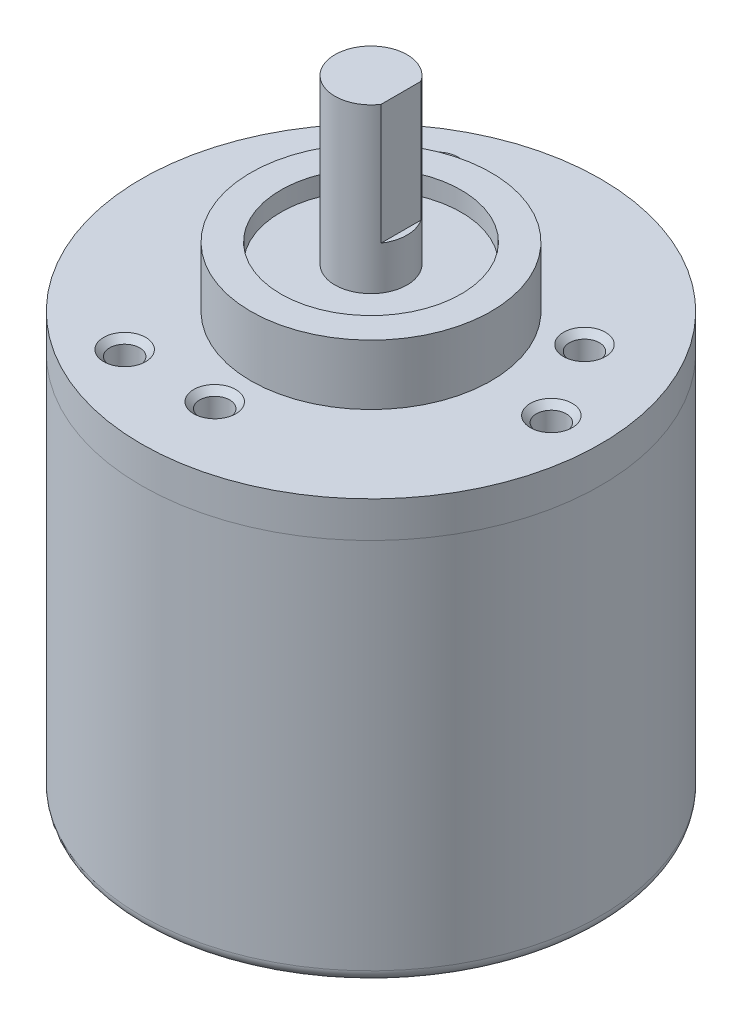
ISO-10303-21;
HEADER;
FILE_DESCRIPTION(('STEP AP214'),'2;1');
FILE_NAME('part.step','',(''),(''),'','','');
FILE_SCHEMA(('AUTOMOTIVE_DESIGN { 1 0 10303 214 1 1 1 1 }'));
ENDSEC;
DATA;
#1=APPLICATION_CONTEXT('core data for automotive mechanical design processes');
#2=APPLICATION_PROTOCOL_DEFINITION('international standard','automotive_design',2000,#1);
#3=PRODUCT_CONTEXT('',#1,'mechanical');
#4=PRODUCT('Part','Part','',(#3));
#5=PRODUCT_RELATED_PRODUCT_CATEGORY('part','',(#4));
#6=PRODUCT_DEFINITION_FORMATION('','',#4);
#7=PRODUCT_DEFINITION_CONTEXT('part definition',#1,'design');
#8=PRODUCT_DEFINITION('design','',#6,#7);
#9=PRODUCT_DEFINITION_SHAPE('','',#8);
#10=(LENGTH_UNIT() NAMED_UNIT(*) SI_UNIT(.MILLI.,.METRE.));
#11=(NAMED_UNIT(*) PLANE_ANGLE_UNIT() SI_UNIT($,.RADIAN.));
#12=(NAMED_UNIT(*) SI_UNIT($,.STERADIAN.) SOLID_ANGLE_UNIT());
#13=UNCERTAINTY_MEASURE_WITH_UNIT(LENGTH_MEASURE(1.E-05),#10,'distance_accuracy_value','');
#14=(GEOMETRIC_REPRESENTATION_CONTEXT(3) GLOBAL_UNCERTAINTY_ASSIGNED_CONTEXT((#13)) GLOBAL_UNIT_ASSIGNED_CONTEXT((#10,
#11,#12)) REPRESENTATION_CONTEXT('',''));
#15=CARTESIAN_POINT('',(0.,0.,0.));
#16=DIRECTION('',(0.,0.,1.));
#17=DIRECTION('',(1.,0.,0.));
#18=AXIS2_PLACEMENT_3D('',#15,#16,#17);
#19=CARTESIAN_POINT('',(0.,38.4,0.));
#20=DIRECTION('',(0.,1.,0.));
#21=DIRECTION('',(0.,0.,1.));
#22=AXIS2_PLACEMENT_3D('',#19,#20,#21);
#23=PLANE('',#22);
#24=CARTESIAN_POINT('',(0.,38.4,0.));
#25=DIRECTION('',(0.,1.,0.));
#26=DIRECTION('',(0.,0.,1.));
#27=AXIS2_PLACEMENT_3D('',#24,#25,#26);
#28=CIRCLE('',#27,7.5);
#29=CARTESIAN_POINT('',(0.,38.4,7.5));
#30=VERTEX_POINT('',#29);
#31=EDGE_CURVE('E97',#30,#30,#28,.T.);
#32=ORIENTED_EDGE('',*,*,#31,.T.);
#33=EDGE_LOOP('',(#32));
#34=FACE_BOUND('',#33,.T.);
#35=CARTESIAN_POINT('',(0.,38.4,0.));
#36=DIRECTION('',(0.,1.,0.));
#37=DIRECTION('',(0.,0.,1.));
#38=AXIS2_PLACEMENT_3D('',#35,#36,#37);
#39=CIRCLE('',#38,3.);
#40=CARTESIAN_POINT('',(0.,38.4,3.));
#41=VERTEX_POINT('',#40);
#42=EDGE_CURVE('E89',#41,#41,#39,.T.);
#43=ORIENTED_EDGE('',*,*,#42,.F.);
#44=EDGE_LOOP('',(#43));
#45=FACE_BOUND('',#44,.T.);
#46=ADVANCED_FACE('F48',(#34,#45),#23,.T.);
#47=CARTESIAN_POINT('',(0.,40.,0.));
#48=DIRECTION('',(0.,-1.,0.));
#49=DIRECTION('',(0.,0.,-1.));
#50=AXIS2_PLACEMENT_3D('',#47,#48,#49);
#51=CYLINDRICAL_SURFACE('',#50,10.);
#52=CARTESIAN_POINT('',(0.,40.,0.));
#53=DIRECTION('',(0.,1.,0.));
#54=DIRECTION('',(0.,0.,1.));
#55=AXIS2_PLACEMENT_3D('',#52,#53,#54);
#56=CIRCLE('',#55,10.);
#57=CARTESIAN_POINT('',(0.,40.,10.));
#58=VERTEX_POINT('',#57);
#59=EDGE_CURVE('E13',#58,#58,#56,.T.);
#60=ORIENTED_EDGE('',*,*,#59,.F.);
#61=EDGE_LOOP('',(#60));
#62=FACE_BOUND('',#61,.T.);
#63=CARTESIAN_POINT('',(0.,35.,0.));
#64=DIRECTION('',(0.,1.,0.));
#65=DIRECTION('',(0.,0.,1.));
#66=AXIS2_PLACEMENT_3D('',#63,#64,#65);
#67=CIRCLE('',#66,10.);
#68=CARTESIAN_POINT('',(0.,35.,10.));
#69=VERTEX_POINT('',#68);
#70=EDGE_CURVE('E52',#69,#69,#67,.T.);
#71=ORIENTED_EDGE('',*,*,#70,.T.);
#72=EDGE_LOOP('',(#71));
#73=FACE_BOUND('',#72,.T.);
#74=ADVANCED_FACE('F50',(#62,#73),#51,.T.);
#75=CARTESIAN_POINT('',(0.,40.,0.));
#76=DIRECTION('',(0.,1.,0.));
#77=DIRECTION('',(0.,0.,1.));
#78=AXIS2_PLACEMENT_3D('',#75,#76,#77);
#79=PLANE('',#78);
#80=CARTESIAN_POINT('',(0.,40.,0.));
#81=DIRECTION('',(0.,1.,0.));
#82=DIRECTION('',(0.,0.,1.));
#83=AXIS2_PLACEMENT_3D('',#80,#81,#82);
#84=CIRCLE('',#83,7.5);
#85=CARTESIAN_POINT('',(0.,40.,7.5));
#86=VERTEX_POINT('',#85);
#87=EDGE_CURVE('E95',#86,#86,#84,.T.);
#88=ORIENTED_EDGE('',*,*,#87,.F.);
#89=EDGE_LOOP('',(#88));
#90=FACE_BOUND('',#89,.T.);
#91=ORIENTED_EDGE('',*,*,#59,.T.);
#92=EDGE_LOOP('',(#91));
#93=FACE_BOUND('',#92,.T.);
#94=ADVANCED_FACE('F105',(#90,#93),#79,.T.);
#95=CARTESIAN_POINT('',(0.,35.,0.));
#96=DIRECTION('',(0.,1.,0.));
#97=DIRECTION('',(0.,0.,1.));
#98=AXIS2_PLACEMENT_3D('',#95,#96,#97);
#99=PLANE('',#98);
#100=ORIENTED_EDGE('',*,*,#70,.F.);
#101=EDGE_LOOP('',(#100));
#102=FACE_BOUND('',#101,.T.);
#103=ADVANCED_FACE('F108',(#102),#99,.F.);
#104=CARTESIAN_POINT('',(0.,38.4,0.));
#105=DIRECTION('',(0.,1.,0.));
#106=DIRECTION('',(0.,0.,1.));
#107=AXIS2_PLACEMENT_3D('',#104,#105,#106);
#108=CYLINDRICAL_SURFACE('',#107,7.5);
#109=ORIENTED_EDGE('',*,*,#31,.F.);
#110=EDGE_LOOP('',(#109));
#111=FACE_BOUND('',#110,.T.);
#112=ORIENTED_EDGE('',*,*,#87,.T.);
#113=EDGE_LOOP('',(#112));
#114=FACE_BOUND('',#113,.T.);
#115=ADVANCED_FACE('F103',(#111,#114),#108,.F.);
#116=CARTESIAN_POINT('',(2.5,72.1394102980499,0.));
#117=DIRECTION('',(1.,0.,0.));
#118=DIRECTION('',(0.,0.,-1.));
#119=AXIS2_PLACEMENT_3D('',#116,#117,#118);
#120=PLANE('',#119);
#121=DIRECTION('',(0.,0.,1.));
#122=VECTOR('',#121,1.);
#123=CARTESIAN_POINT('',(2.5,42.,0.));
#124=LINE('',#123,#122);
#125=CARTESIAN_POINT('',(2.5,42.,-1.6583123951777));
#126=VERTEX_POINT('',#125);
#127=CARTESIAN_POINT('',(2.5,42.,1.6583123951777));
#128=VERTEX_POINT('',#127);
#129=EDGE_CURVE('E63',#126,#128,#124,.T.);
#130=ORIENTED_EDGE('',*,*,#129,.F.);
#131=DIRECTION('',(0.,-1.,0.));
#132=VECTOR('',#131,1.);
#133=CARTESIAN_POINT('',(2.5,72.1394102980499,-1.6583123951777));
#134=LINE('',#133,#132);
#135=CARTESIAN_POINT('',(2.5,52.,-1.6583123951777));
#136=VERTEX_POINT('',#135);
#137=EDGE_CURVE('E79',#136,#126,#134,.T.);
#138=ORIENTED_EDGE('',*,*,#137,.F.);
#139=DIRECTION('',(0.,0.,1.));
#140=VECTOR('',#139,1.);
#141=CARTESIAN_POINT('',(2.5,52.,0.));
#142=LINE('',#141,#140);
#143=CARTESIAN_POINT('',(2.5,52.,1.6583123951777));
#144=VERTEX_POINT('',#143);
#145=EDGE_CURVE('E77',#136,#144,#142,.T.);
#146=ORIENTED_EDGE('',*,*,#145,.T.);
#147=DIRECTION('',(0.,-1.,0.));
#148=VECTOR('',#147,1.);
#149=CARTESIAN_POINT('',(2.5,72.1394102980499,1.6583123951777));
#150=LINE('',#149,#148);
#151=EDGE_CURVE('E70',#144,#128,#150,.T.);
#152=ORIENTED_EDGE('',*,*,#151,.T.);
#153=EDGE_LOOP('',(#130,#138,#146,#152));
#154=FACE_BOUND('',#153,.T.);
#155=ADVANCED_FACE('F75',(#154),#120,.T.);
#156=CARTESIAN_POINT('',(0.,72.1394102980499,0.));
#157=DIRECTION('',(0.,-1.,0.));
#158=DIRECTION('',(0.,0.,-1.));
#159=AXIS2_PLACEMENT_3D('',#156,#157,#158);
#160=CYLINDRICAL_SURFACE('',#159,3.);
#161=ORIENTED_EDGE('',*,*,#42,.T.);
#162=EDGE_LOOP('',(#161));
#163=FACE_BOUND('',#162,.T.);
#164=ORIENTED_EDGE('',*,*,#137,.T.);
#165=CARTESIAN_POINT('',(0.,42.,0.));
#166=DIRECTION('',(0.,1.,0.));
#167=DIRECTION('',(0.,0.,1.));
#168=AXIS2_PLACEMENT_3D('',#165,#166,#167);
#169=CIRCLE('',#168,3.);
#170=EDGE_CURVE('E84',#128,#126,#169,.T.);
#171=ORIENTED_EDGE('',*,*,#170,.F.);
#172=ORIENTED_EDGE('',*,*,#151,.F.);
#173=CARTESIAN_POINT('',(0.,52.,0.));
#174=DIRECTION('',(0.,1.,0.));
#175=DIRECTION('',(0.,0.,1.));
#176=AXIS2_PLACEMENT_3D('',#173,#174,#175);
#177=CIRCLE('',#176,3.);
#178=EDGE_CURVE('E92',#136,#144,#177,.T.);
#179=ORIENTED_EDGE('',*,*,#178,.F.);
#180=EDGE_LOOP('',(#164,#171,#172,#179));
#181=FACE_BOUND('',#180,.T.);
#182=ADVANCED_FACE('F86',(#163,#181),#160,.T.);
#183=CARTESIAN_POINT('',(0.,52.,0.));
#184=DIRECTION('',(0.,1.,0.));
#185=DIRECTION('',(0.,0.,1.));
#186=AXIS2_PLACEMENT_3D('',#183,#184,#185);
#187=PLANE('',#186);
#188=ORIENTED_EDGE('',*,*,#145,.F.);
#189=ORIENTED_EDGE('',*,*,#178,.T.);
#190=EDGE_LOOP('',(#188,#189));
#191=FACE_BOUND('',#190,.T.);
#192=ADVANCED_FACE('F130',(#191),#187,.T.);
#193=CARTESIAN_POINT('',(0.,42.,0.));
#194=DIRECTION('',(0.,1.,0.));
#195=DIRECTION('',(0.,0.,1.));
#196=AXIS2_PLACEMENT_3D('',#193,#194,#195);
#197=PLANE('',#196);
#198=ORIENTED_EDGE('',*,*,#170,.T.);
#199=ORIENTED_EDGE('',*,*,#129,.T.);
#200=EDGE_LOOP('',(#198,#199));
#201=FACE_BOUND('',#200,.T.);
#202=ADVANCED_FACE('F83',(#201),#197,.T.);
#203=CLOSED_SHELL('',(#46,#74,#94,#103,#115,#155,#182,#192,#202));
#204=MANIFOLD_SOLID_BREP('B2',#203);
#205=CARTESIAN_POINT('',(0.,35.,0.));
#206=DIRECTION('',(0.,-1.,0.));
#207=DIRECTION('',(0.,0.,-1.));
#208=AXIS2_PLACEMENT_3D('',#205,#206,#207);
#209=CYLINDRICAL_SURFACE('',#208,19.1);
#210=CARTESIAN_POINT('',(0.,35.,0.));
#211=DIRECTION('',(0.,1.,0.));
#212=DIRECTION('',(0.,0.,1.));
#213=AXIS2_PLACEMENT_3D('',#210,#211,#212);
#214=CIRCLE('',#213,19.1);
#215=CARTESIAN_POINT('',(0.,35.,19.1));
#216=VERTEX_POINT('',#215);
#217=EDGE_CURVE('E259',#216,#216,#214,.T.);
#218=ORIENTED_EDGE('',*,*,#217,.F.);
#219=EDGE_LOOP('',(#218));
#220=FACE_BOUND('',#219,.T.);
#221=CARTESIAN_POINT('',(0.,32.,0.));
#222=DIRECTION('',(0.,1.,0.));
#223=DIRECTION('',(0.,0.,1.));
#224=AXIS2_PLACEMENT_3D('',#221,#222,#223);
#225=CIRCLE('',#224,19.1);
#226=CARTESIAN_POINT('',(0.,32.,19.1));
#227=VERTEX_POINT('',#226);
#228=EDGE_CURVE('E263',#227,#227,#225,.T.);
#229=ORIENTED_EDGE('',*,*,#228,.T.);
#230=EDGE_LOOP('',(#229));
#231=FACE_BOUND('',#230,.T.);
#232=ADVANCED_FACE('F215',(#220,#231),#209,.T.);
#233=CARTESIAN_POINT('',(-7.49999999999997,35.,12.9903810567666));
#234=DIRECTION('',(0.,-1.,0.));
#235=DIRECTION('',(0.,0.,-1.));
#236=AXIS2_PLACEMENT_3D('',#233,#234,#235);
#237=CYLINDRICAL_SURFACE('',#236,1.25);
#238=CARTESIAN_POINT('',(-7.49999999999997,34.5,12.9903810567666));
#239=DIRECTION('',(0.,1.,0.));
#240=DIRECTION('',(0.,0.,1.));
#241=AXIS2_PLACEMENT_3D('',#238,#239,#240);
#242=CIRCLE('',#241,1.25);
#243=CARTESIAN_POINT('',(-7.49999999999997,34.5,14.2403810567666));
#244=VERTEX_POINT('',#243);
#245=EDGE_CURVE('E230',#244,#244,#242,.T.);
#246=ORIENTED_EDGE('',*,*,#245,.T.);
#247=EDGE_LOOP('',(#246));
#248=FACE_BOUND('',#247,.T.);
#249=CARTESIAN_POINT('',(-7.49999999999997,32.,12.9903810567666));
#250=DIRECTION('',(0.,1.,0.));
#251=DIRECTION('',(0.,0.,1.));
#252=AXIS2_PLACEMENT_3D('',#249,#250,#251);
#253=CIRCLE('',#252,1.25);
#254=CARTESIAN_POINT('',(-7.49999999999997,32.,14.2403810567666));
#255=VERTEX_POINT('',#254);
#256=EDGE_CURVE('E266',#255,#255,#253,.T.);
#257=ORIENTED_EDGE('',*,*,#256,.F.);
#258=EDGE_LOOP('',(#257));
#259=FACE_BOUND('',#258,.T.);
#260=ADVANCED_FACE('F288',(#248,#259),#237,.F.);
#261=CARTESIAN_POINT('',(15.,35.,0.));
#262=DIRECTION('',(0.,-1.,0.));
#263=DIRECTION('',(0.,0.,-1.));
#264=AXIS2_PLACEMENT_3D('',#261,#262,#263);
#265=CYLINDRICAL_SURFACE('',#264,1.25);
#266=CARTESIAN_POINT('',(15.,34.5,0.));
#267=DIRECTION('',(0.,1.,0.));
#268=DIRECTION('',(0.,0.,1.));
#269=AXIS2_PLACEMENT_3D('',#266,#267,#268);
#270=CIRCLE('',#269,1.25);
#271=CARTESIAN_POINT('',(15.,34.5,1.25));
#272=VERTEX_POINT('',#271);
#273=EDGE_CURVE('E222',#272,#272,#270,.T.);
#274=ORIENTED_EDGE('',*,*,#273,.T.);
#275=EDGE_LOOP('',(#274));
#276=FACE_BOUND('',#275,.T.);
#277=CARTESIAN_POINT('',(15.,32.,0.));
#278=DIRECTION('',(0.,1.,0.));
#279=DIRECTION('',(0.,0.,1.));
#280=AXIS2_PLACEMENT_3D('',#277,#278,#279);
#281=CIRCLE('',#280,1.25);
#282=CARTESIAN_POINT('',(15.,32.,1.25));
#283=VERTEX_POINT('',#282);
#284=EDGE_CURVE('E269',#283,#283,#281,.T.);
#285=ORIENTED_EDGE('',*,*,#284,.F.);
#286=EDGE_LOOP('',(#285));
#287=FACE_BOUND('',#286,.T.);
#288=ADVANCED_FACE('F317',(#276,#287),#265,.F.);
#289=CARTESIAN_POINT('',(-7.49999999999997,35.,-12.9903810567666));
#290=DIRECTION('',(0.,-1.,0.));
#291=DIRECTION('',(0.,0.,-1.));
#292=AXIS2_PLACEMENT_3D('',#289,#290,#291);
#293=CYLINDRICAL_SURFACE('',#292,1.25);
#294=CARTESIAN_POINT('',(-7.49999999999997,34.5,-12.9903810567666));
#295=DIRECTION('',(0.,1.,0.));
#296=DIRECTION('',(0.,0.,1.));
#297=AXIS2_PLACEMENT_3D('',#294,#295,#296);
#298=CIRCLE('',#297,1.25);
#299=CARTESIAN_POINT('',(-7.49999999999997,34.5,-11.7403810567666));
#300=VERTEX_POINT('',#299);
#301=EDGE_CURVE('E256',#300,#300,#298,.T.);
#302=ORIENTED_EDGE('',*,*,#301,.T.);
#303=EDGE_LOOP('',(#302));
#304=FACE_BOUND('',#303,.T.);
#305=CARTESIAN_POINT('',(-7.49999999999997,32.,-12.9903810567666));
#306=DIRECTION('',(0.,1.,0.));
#307=DIRECTION('',(0.,0.,1.));
#308=AXIS2_PLACEMENT_3D('',#305,#306,#307);
#309=CIRCLE('',#308,1.25);
#310=CARTESIAN_POINT('',(-7.49999999999997,32.,-11.7403810567666));
#311=VERTEX_POINT('',#310);
#312=EDGE_CURVE('E272',#311,#311,#309,.T.);
#313=ORIENTED_EDGE('',*,*,#312,.F.);
#314=EDGE_LOOP('',(#313));
#315=FACE_BOUND('',#314,.T.);
#316=ADVANCED_FACE('F321',(#304,#315),#293,.F.);
#317=CARTESIAN_POINT('',(11.2583333333333,35.,-6.49999465811746));
#318=DIRECTION('',(0.,-1.,0.));
#319=DIRECTION('',(0.,0.,-1.));
#320=AXIS2_PLACEMENT_3D('',#317,#318,#319);
#321=CYLINDRICAL_SURFACE('',#320,1.25);
#322=CARTESIAN_POINT('',(11.2583333333333,34.5,-6.49999465811746));
#323=DIRECTION('',(0.,1.,0.));
#324=DIRECTION('',(0.,0.,1.));
#325=AXIS2_PLACEMENT_3D('',#322,#323,#324);
#326=CIRCLE('',#325,1.25);
#327=CARTESIAN_POINT('',(11.2583333333333,34.5,-5.24999465811746));
#328=VERTEX_POINT('',#327);
#329=EDGE_CURVE('E47',#328,#328,#326,.T.);
#330=ORIENTED_EDGE('',*,*,#329,.T.);
#331=EDGE_LOOP('',(#330));
#332=FACE_BOUND('',#331,.T.);
#333=CARTESIAN_POINT('',(11.2583333333333,32.,-6.49999465811746));
#334=DIRECTION('',(0.,1.,0.));
#335=DIRECTION('',(0.,0.,1.));
#336=AXIS2_PLACEMENT_3D('',#333,#334,#335);
#337=CIRCLE('',#336,1.25);
#338=CARTESIAN_POINT('',(11.2583333333333,32.,-5.24999465811746));
#339=VERTEX_POINT('',#338);
#340=EDGE_CURVE('E275',#339,#339,#337,.T.);
#341=ORIENTED_EDGE('',*,*,#340,.F.);
#342=EDGE_LOOP('',(#341));
#343=FACE_BOUND('',#342,.T.);
#344=ADVANCED_FACE('F311',(#332,#343),#321,.F.);
#345=CARTESIAN_POINT('',(-11.2583271650596,35.,-6.50000534188102));
#346=DIRECTION('',(0.,-1.,0.));
#347=DIRECTION('',(0.,0.,-1.));
#348=AXIS2_PLACEMENT_3D('',#345,#346,#347);
#349=CYLINDRICAL_SURFACE('',#348,1.25);
#350=CARTESIAN_POINT('',(-11.2583271650596,34.5,-6.50000534188102));
#351=DIRECTION('',(0.,1.,0.));
#352=DIRECTION('',(0.,0.,1.));
#353=AXIS2_PLACEMENT_3D('',#350,#351,#352);
#354=CIRCLE('',#353,1.25);
#355=CARTESIAN_POINT('',(-11.2583271650596,34.5,-5.25000534188102));
#356=VERTEX_POINT('',#355);
#357=EDGE_CURVE('E235',#356,#356,#354,.T.);
#358=ORIENTED_EDGE('',*,*,#357,.T.);
#359=EDGE_LOOP('',(#358));
#360=FACE_BOUND('',#359,.T.);
#361=CARTESIAN_POINT('',(-11.2583271650596,32.,-6.50000534188102));
#362=DIRECTION('',(0.,1.,0.));
#363=DIRECTION('',(0.,0.,1.));
#364=AXIS2_PLACEMENT_3D('',#361,#362,#363);
#365=CIRCLE('',#364,1.25);
#366=CARTESIAN_POINT('',(-11.2583271650596,32.,-5.25000534188102));
#367=VERTEX_POINT('',#366);
#368=EDGE_CURVE('E278',#367,#367,#365,.T.);
#369=ORIENTED_EDGE('',*,*,#368,.F.);
#370=EDGE_LOOP('',(#369));
#371=FACE_BOUND('',#370,.T.);
#372=ADVANCED_FACE('F302',(#360,#371),#349,.F.);
#373=CARTESIAN_POINT('',(-6.16827376452394E-06,35.,12.9999999999985));
#374=DIRECTION('',(0.,-1.,0.));
#375=DIRECTION('',(0.,0.,-1.));
#376=AXIS2_PLACEMENT_3D('',#373,#374,#375);
#377=CYLINDRICAL_SURFACE('',#376,1.25);
#378=CARTESIAN_POINT('',(-6.16827376452394E-06,34.5,12.9999999999985));
#379=DIRECTION('',(0.,1.,0.));
#380=DIRECTION('',(0.,0.,1.));
#381=AXIS2_PLACEMENT_3D('',#378,#379,#380);
#382=CIRCLE('',#381,1.25);
#383=CARTESIAN_POINT('',(-6.16827376452394E-06,34.5,14.2499999999985));
#384=VERTEX_POINT('',#383);
#385=EDGE_CURVE('E226',#384,#384,#382,.T.);
#386=ORIENTED_EDGE('',*,*,#385,.T.);
#387=EDGE_LOOP('',(#386));
#388=FACE_BOUND('',#387,.T.);
#389=CARTESIAN_POINT('',(-6.16827376452394E-06,32.,12.9999999999985));
#390=DIRECTION('',(0.,1.,0.));
#391=DIRECTION('',(0.,0.,1.));
#392=AXIS2_PLACEMENT_3D('',#389,#390,#391);
#393=CIRCLE('',#392,1.25);
#394=CARTESIAN_POINT('',(-6.16827376452394E-06,32.,14.2499999999985));
#395=VERTEX_POINT('',#394);
#396=EDGE_CURVE('E260',#395,#395,#393,.T.);
#397=ORIENTED_EDGE('',*,*,#396,.F.);
#398=EDGE_LOOP('',(#397));
#399=FACE_BOUND('',#398,.T.);
#400=ADVANCED_FACE('F300',(#388,#399),#377,.F.);
#401=CARTESIAN_POINT('',(0.,35.,0.));
#402=DIRECTION('',(0.,1.,0.));
#403=DIRECTION('',(0.,0.,1.));
#404=AXIS2_PLACEMENT_3D('',#401,#402,#403);
#405=PLANE('',#404);
#406=CARTESIAN_POINT('',(-7.49999999999997,35.,-12.9903810567666));
#407=DIRECTION('',(0.,1.,0.));
#408=DIRECTION('',(0.,0.,1.));
#409=AXIS2_PLACEMENT_3D('',#406,#407,#408);
#410=CIRCLE('',#409,1.74999999999999);
#411=CARTESIAN_POINT('',(-7.49999999999997,35.,-11.2403810567666));
#412=VERTEX_POINT('',#411);
#413=EDGE_CURVE('E238',#412,#412,#410,.F.);
#414=ORIENTED_EDGE('',*,*,#413,.T.);
#415=EDGE_LOOP('',(#414));
#416=FACE_BOUND('',#415,.T.);
#417=CARTESIAN_POINT('',(-11.2583271650596,35.,-6.50000534188102));
#418=DIRECTION('',(0.,1.,0.));
#419=DIRECTION('',(0.,0.,1.));
#420=AXIS2_PLACEMENT_3D('',#417,#418,#419);
#421=CIRCLE('',#420,1.75);
#422=CARTESIAN_POINT('',(-11.2583271650596,35.,-4.75000534188102));
#423=VERTEX_POINT('',#422);
#424=EDGE_CURVE('E241',#423,#423,#421,.F.);
#425=ORIENTED_EDGE('',*,*,#424,.T.);
#426=EDGE_LOOP('',(#425));
#427=FACE_BOUND('',#426,.T.);
#428=CARTESIAN_POINT('',(-7.49999999999997,35.,12.9903810567666));
#429=DIRECTION('',(0.,1.,0.));
#430=DIRECTION('',(0.,0.,1.));
#431=AXIS2_PLACEMENT_3D('',#428,#429,#430);
#432=CIRCLE('',#431,1.74999999999999);
#433=CARTESIAN_POINT('',(-7.49999999999997,35.,14.7403810567666));
#434=VERTEX_POINT('',#433);
#435=EDGE_CURVE('E244',#434,#434,#432,.F.);
#436=ORIENTED_EDGE('',*,*,#435,.T.);
#437=EDGE_LOOP('',(#436));
#438=FACE_BOUND('',#437,.T.);
#439=CARTESIAN_POINT('',(-6.16827376452394E-06,35.,12.9999999999985));
#440=DIRECTION('',(0.,1.,0.));
#441=DIRECTION('',(0.,0.,1.));
#442=AXIS2_PLACEMENT_3D('',#439,#440,#441);
#443=CIRCLE('',#442,1.74999999999999);
#444=CARTESIAN_POINT('',(-6.16827376452394E-06,35.,14.7499999999985));
#445=VERTEX_POINT('',#444);
#446=EDGE_CURVE('E247',#445,#445,#443,.F.);
#447=ORIENTED_EDGE('',*,*,#446,.T.);
#448=EDGE_LOOP('',(#447));
#449=FACE_BOUND('',#448,.T.);
#450=CARTESIAN_POINT('',(15.,35.,0.));
#451=DIRECTION('',(0.,1.,0.));
#452=DIRECTION('',(0.,0.,1.));
#453=AXIS2_PLACEMENT_3D('',#450,#451,#452);
#454=CIRCLE('',#453,1.74999999999999);
#455=CARTESIAN_POINT('',(15.,35.,1.74999999999999));
#456=VERTEX_POINT('',#455);
#457=EDGE_CURVE('E250',#456,#456,#454,.F.);
#458=ORIENTED_EDGE('',*,*,#457,.T.);
#459=EDGE_LOOP('',(#458));
#460=FACE_BOUND('',#459,.T.);
#461=CARTESIAN_POINT('',(11.2583333333333,35.,-6.49999465811746));
#462=DIRECTION('',(0.,1.,0.));
#463=DIRECTION('',(0.,0.,1.));
#464=AXIS2_PLACEMENT_3D('',#461,#462,#463);
#465=CIRCLE('',#464,1.75);
#466=CARTESIAN_POINT('',(11.2583333333333,35.,-4.74999465811747));
#467=VERTEX_POINT('',#466);
#468=EDGE_CURVE('E253',#467,#467,#465,.F.);
#469=ORIENTED_EDGE('',*,*,#468,.T.);
#470=EDGE_LOOP('',(#469));
#471=FACE_BOUND('',#470,.T.);
#472=ORIENTED_EDGE('',*,*,#217,.T.);
#473=EDGE_LOOP('',(#472));
#474=FACE_BOUND('',#473,.T.);
#475=ADVANCED_FACE('F284',(#416,#427,#438,#449,#460,#471,#474),#405,.T.);
#476=CARTESIAN_POINT('',(0.,32.,0.));
#477=DIRECTION('',(0.,1.,0.));
#478=DIRECTION('',(0.,0.,1.));
#479=AXIS2_PLACEMENT_3D('',#476,#477,#478);
#480=PLANE('',#479);
#481=ORIENTED_EDGE('',*,*,#368,.T.);
#482=EDGE_LOOP('',(#481));
#483=FACE_BOUND('',#482,.T.);
#484=ORIENTED_EDGE('',*,*,#340,.T.);
#485=EDGE_LOOP('',(#484));
#486=FACE_BOUND('',#485,.T.);
#487=ORIENTED_EDGE('',*,*,#312,.T.);
#488=EDGE_LOOP('',(#487));
#489=FACE_BOUND('',#488,.T.);
#490=ORIENTED_EDGE('',*,*,#284,.T.);
#491=EDGE_LOOP('',(#490));
#492=FACE_BOUND('',#491,.T.);
#493=ORIENTED_EDGE('',*,*,#256,.T.);
#494=EDGE_LOOP('',(#493));
#495=FACE_BOUND('',#494,.T.);
#496=ORIENTED_EDGE('',*,*,#228,.F.);
#497=EDGE_LOOP('',(#496));
#498=FACE_BOUND('',#497,.T.);
#499=ORIENTED_EDGE('',*,*,#396,.T.);
#500=EDGE_LOOP('',(#499));
#501=FACE_BOUND('',#500,.T.);
#502=ADVANCED_FACE('F292',(#483,#486,#489,#492,#495,#498,#501),#480,.F.);
#503=CARTESIAN_POINT('',(-7.49999999999997,34.5,-12.9903810567666));
#504=DIRECTION('',(0.,1.,0.));
#505=DIRECTION('',(0.,0.,1.));
#506=AXIS2_PLACEMENT_3D('',#503,#504,#505);
#507=CONICAL_SURFACE('',#506,1.25,0.785398163397442);
#508=ORIENTED_EDGE('',*,*,#413,.F.);
#509=EDGE_LOOP('',(#508));
#510=FACE_BOUND('',#509,.T.);
#511=ORIENTED_EDGE('',*,*,#301,.F.);
#512=EDGE_LOOP('',(#511));
#513=FACE_BOUND('',#512,.T.);
#514=ADVANCED_FACE('F295',(#510,#513),#507,.F.);
#515=CARTESIAN_POINT('',(-11.2583271650596,34.5,-6.50000534188102));
#516=DIRECTION('',(0.,1.,0.));
#517=DIRECTION('',(0.,0.,1.));
#518=AXIS2_PLACEMENT_3D('',#515,#516,#517);
#519=CONICAL_SURFACE('',#518,1.25,0.785398163397444);
#520=ORIENTED_EDGE('',*,*,#424,.F.);
#521=EDGE_LOOP('',(#520));
#522=FACE_BOUND('',#521,.T.);
#523=ORIENTED_EDGE('',*,*,#357,.F.);
#524=EDGE_LOOP('',(#523));
#525=FACE_BOUND('',#524,.T.);
#526=ADVANCED_FACE('F329',(#522,#525),#519,.F.);
#527=CARTESIAN_POINT('',(-7.49999999999997,34.5,12.9903810567666));
#528=DIRECTION('',(0.,1.,0.));
#529=DIRECTION('',(0.,0.,1.));
#530=AXIS2_PLACEMENT_3D('',#527,#528,#529);
#531=CONICAL_SURFACE('',#530,1.25,0.785398163397442);
#532=ORIENTED_EDGE('',*,*,#435,.F.);
#533=EDGE_LOOP('',(#532));
#534=FACE_BOUND('',#533,.T.);
#535=ORIENTED_EDGE('',*,*,#245,.F.);
#536=EDGE_LOOP('',(#535));
#537=FACE_BOUND('',#536,.T.);
#538=ADVANCED_FACE('F333',(#534,#537),#531,.F.);
#539=CARTESIAN_POINT('',(-6.16827376452394E-06,34.5,12.9999999999985));
#540=DIRECTION('',(0.,1.,0.));
#541=DIRECTION('',(0.,0.,1.));
#542=AXIS2_PLACEMENT_3D('',#539,#540,#541);
#543=CONICAL_SURFACE('',#542,1.25,0.785398163397442);
#544=ORIENTED_EDGE('',*,*,#446,.F.);
#545=EDGE_LOOP('',(#544));
#546=FACE_BOUND('',#545,.T.);
#547=ORIENTED_EDGE('',*,*,#385,.F.);
#548=EDGE_LOOP('',(#547));
#549=FACE_BOUND('',#548,.T.);
#550=ADVANCED_FACE('F337',(#546,#549),#543,.F.);
#551=CARTESIAN_POINT('',(15.,34.5,0.));
#552=DIRECTION('',(0.,1.,0.));
#553=DIRECTION('',(0.,0.,1.));
#554=AXIS2_PLACEMENT_3D('',#551,#552,#553);
#555=CONICAL_SURFACE('',#554,1.25,0.785398163397448);
#556=ORIENTED_EDGE('',*,*,#457,.F.);
#557=EDGE_LOOP('',(#556));
#558=FACE_BOUND('',#557,.T.);
#559=ORIENTED_EDGE('',*,*,#273,.F.);
#560=EDGE_LOOP('',(#559));
#561=FACE_BOUND('',#560,.T.);
#562=ADVANCED_FACE('F340',(#558,#561),#555,.F.);
#563=CARTESIAN_POINT('',(11.2583333333333,34.5,-6.49999465811746));
#564=DIRECTION('',(0.,1.,0.));
#565=DIRECTION('',(0.,0.,1.));
#566=AXIS2_PLACEMENT_3D('',#563,#564,#565);
#567=CONICAL_SURFACE('',#566,1.25,0.785398163397444);
#568=ORIENTED_EDGE('',*,*,#468,.F.);
#569=EDGE_LOOP('',(#568));
#570=FACE_BOUND('',#569,.T.);
#571=ORIENTED_EDGE('',*,*,#329,.F.);
#572=EDGE_LOOP('',(#571));
#573=FACE_BOUND('',#572,.T.);
#574=ADVANCED_FACE('F217',(#570,#573),#567,.F.);
#575=CLOSED_SHELL('',(#232,#260,#288,#316,#344,#372,#400,#475,#502,#514,#526,#538,#550,#562,#574));
#576=MANIFOLD_SOLID_BREP('B7',#575);
#577=CARTESIAN_POINT('',(0.,32.,0.));
#578=DIRECTION('',(0.,-1.,0.));
#579=DIRECTION('',(0.,0.,-1.));
#580=AXIS2_PLACEMENT_3D('',#577,#578,#579);
#581=CYLINDRICAL_SURFACE('',#580,19.1);
#582=CARTESIAN_POINT('',(0.,1.,0.));
#583=DIRECTION('',(0.,1.,0.));
#584=DIRECTION('',(0.,0.,1.));
#585=AXIS2_PLACEMENT_3D('',#582,#583,#584);
#586=CIRCLE('',#585,19.1);
#587=CARTESIAN_POINT('',(0.,1.,19.1));
#588=VERTEX_POINT('',#587);
#589=EDGE_CURVE('E496',#588,#588,#586,.T.);
#590=ORIENTED_EDGE('',*,*,#589,.T.);
#591=EDGE_LOOP('',(#590));
#592=FACE_BOUND('',#591,.T.);
#593=CARTESIAN_POINT('',(0.,32.,0.));
#594=DIRECTION('',(0.,1.,0.));
#595=DIRECTION('',(0.,0.,1.));
#596=AXIS2_PLACEMENT_3D('',#593,#594,#595);
#597=CIRCLE('',#596,19.1);
#598=CARTESIAN_POINT('',(0.,32.,19.1));
#599=VERTEX_POINT('',#598);
#600=EDGE_CURVE('E500',#599,#599,#597,.T.);
#601=ORIENTED_EDGE('',*,*,#600,.F.);
#602=EDGE_LOOP('',(#601));
#603=FACE_BOUND('',#602,.T.);
#604=ADVANCED_FACE('F489',(#592,#603),#581,.T.);
#605=CARTESIAN_POINT('',(0.,32.,0.));
#606=DIRECTION('',(0.,1.,0.));
#607=DIRECTION('',(0.,0.,1.));
#608=AXIS2_PLACEMENT_3D('',#605,#606,#607);
#609=PLANE('',#608);
#610=ORIENTED_EDGE('',*,*,#600,.T.);
#611=EDGE_LOOP('',(#610));
#612=FACE_BOUND('',#611,.T.);
#613=ADVANCED_FACE('F507',(#612),#609,.T.);
#614=CARTESIAN_POINT('',(0.,0.,0.));
#615=DIRECTION('',(0.,1.,0.));
#616=DIRECTION('',(0.,0.,1.));
#617=AXIS2_PLACEMENT_3D('',#614,#615,#616);
#618=PLANE('',#617);
#619=CARTESIAN_POINT('',(0.,0.,0.));
#620=DIRECTION('',(0.,1.,0.));
#621=DIRECTION('',(0.,0.,1.));
#622=AXIS2_PLACEMENT_3D('',#619,#620,#621);
#623=CIRCLE('',#622,18.1);
#624=CARTESIAN_POINT('',(0.,0.,18.1));
#625=VERTEX_POINT('',#624);
#626=EDGE_CURVE('E214',#625,#625,#623,.F.);
#627=ORIENTED_EDGE('',*,*,#626,.T.);
#628=EDGE_LOOP('',(#627));
#629=FACE_BOUND('',#628,.T.);
#630=ADVANCED_FACE('F513',(#629),#618,.F.);
#631=CARTESIAN_POINT('',(0.,1.,0.));
#632=DIRECTION('',(0.,1.,0.));
#633=DIRECTION('',(0.,0.,1.));
#634=AXIS2_PLACEMENT_3D('',#631,#632,#633);
#635=TOROIDAL_SURFACE('',#634,18.1,1.);
#636=ORIENTED_EDGE('',*,*,#626,.F.);
#637=EDGE_LOOP('',(#636));
#638=FACE_BOUND('',#637,.T.);
#639=ORIENTED_EDGE('',*,*,#589,.F.);
#640=EDGE_LOOP('',(#639));
#641=FACE_BOUND('',#640,.T.);
#642=ADVANCED_FACE('F491',(#638,#641),#635,.T.);
#643=CLOSED_SHELL('',(#604,#613,#630,#642));
#644=MANIFOLD_SOLID_BREP('B42',#643);
#645=ADVANCED_BREP_SHAPE_REPRESENTATION('',(#18,#204,#576,#644),#14);
#646=SHAPE_DEFINITION_REPRESENTATION(#9,#645);
ENDSEC;
END-ISO-10303-21;
